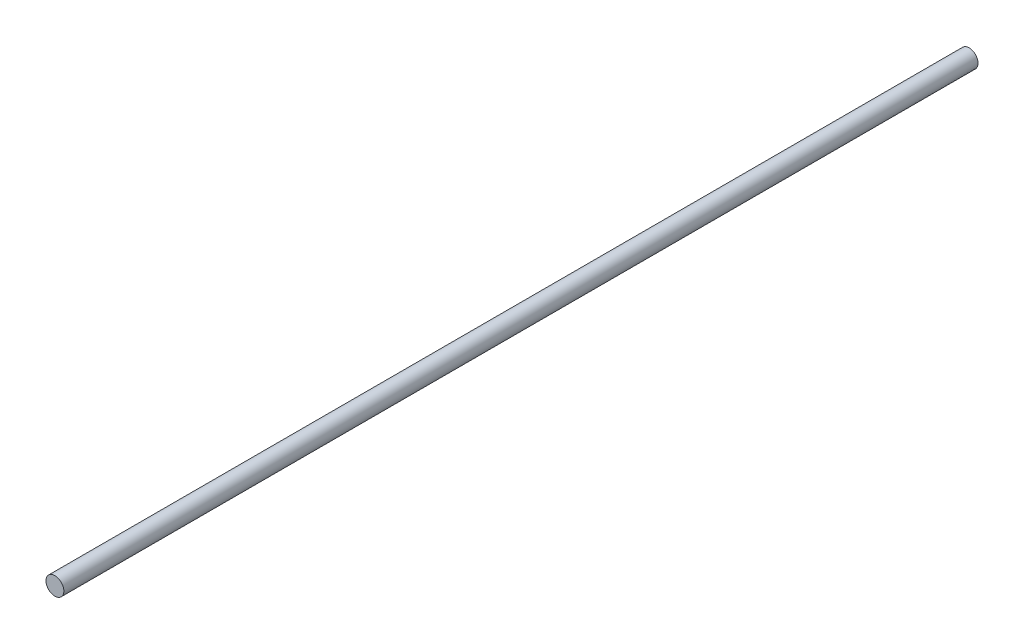
ISO-10303-21;
HEADER;
FILE_DESCRIPTION(('STEP AP214'),'2;1');
FILE_NAME('part.step','',(''),(''),'','','');
FILE_SCHEMA(('AUTOMOTIVE_DESIGN { 1 0 10303 214 1 1 1 1 }'));
ENDSEC;
DATA;
#1=APPLICATION_CONTEXT('core data for automotive mechanical design processes');
#2=APPLICATION_PROTOCOL_DEFINITION('international standard','automotive_design',2000,#1);
#3=PRODUCT_CONTEXT('',#1,'mechanical');
#4=PRODUCT('Part','Part','',(#3));
#5=PRODUCT_RELATED_PRODUCT_CATEGORY('part','',(#4));
#6=PRODUCT_DEFINITION_FORMATION('','',#4);
#7=PRODUCT_DEFINITION_CONTEXT('part definition',#1,'design');
#8=PRODUCT_DEFINITION('design','',#6,#7);
#9=PRODUCT_DEFINITION_SHAPE('','',#8);
#10=(LENGTH_UNIT() NAMED_UNIT(*) SI_UNIT(.MILLI.,.METRE.));
#11=(NAMED_UNIT(*) PLANE_ANGLE_UNIT() SI_UNIT($,.RADIAN.));
#12=(NAMED_UNIT(*) SI_UNIT($,.STERADIAN.) SOLID_ANGLE_UNIT());
#13=UNCERTAINTY_MEASURE_WITH_UNIT(LENGTH_MEASURE(1.E-05),#10,'distance_accuracy_value','');
#14=(GEOMETRIC_REPRESENTATION_CONTEXT(3) GLOBAL_UNCERTAINTY_ASSIGNED_CONTEXT((#13)) GLOBAL_UNIT_ASSIGNED_CONTEXT((#10,
#11,#12)) REPRESENTATION_CONTEXT('',''));
#15=CARTESIAN_POINT('',(0.,0.,0.));
#16=DIRECTION('',(0.,0.,1.));
#17=DIRECTION('',(1.,0.,0.));
#18=AXIS2_PLACEMENT_3D('',#15,#16,#17);
#19=CARTESIAN_POINT('',(0.,0.,-631.970562748477));
#20=DIRECTION('',(0.,0.,1.));
#21=DIRECTION('',(1.,0.,0.));
#22=AXIS2_PLACEMENT_3D('',#19,#20,#21);
#23=CYLINDRICAL_SURFACE('',#22,5.99999999999999);
#24=CARTESIAN_POINT('',(0.,0.,-615.));
#25=DIRECTION('',(0.,0.,1.));
#26=DIRECTION('',(1.,0.,0.));
#27=AXIS2_PLACEMENT_3D('',#24,#25,#26);
#28=CIRCLE('',#27,5.99999999999999);
#29=CARTESIAN_POINT('',(5.99999999999999,0.,-615.));
#30=VERTEX_POINT('',#29);
#31=EDGE_CURVE('E10',#30,#30,#28,.F.);
#32=ORIENTED_EDGE('',*,*,#31,.F.);
#33=EDGE_LOOP('',(#32));
#34=FACE_BOUND('',#33,.T.);
#35=CARTESIAN_POINT('',(0.,0.,0.));
#36=DIRECTION('',(0.,0.,1.));
#37=DIRECTION('',(1.,0.,0.));
#38=AXIS2_PLACEMENT_3D('',#35,#36,#37);
#39=CIRCLE('',#38,5.99999999999999);
#40=CARTESIAN_POINT('',(5.99999999999999,0.,0.));
#41=VERTEX_POINT('',#40);
#42=EDGE_CURVE('E37',#41,#41,#39,.T.);
#43=ORIENTED_EDGE('',*,*,#42,.F.);
#44=EDGE_LOOP('',(#43));
#45=FACE_BOUND('',#44,.T.);
#46=ADVANCED_FACE('F31',(#34,#45),#23,.T.);
#47=CARTESIAN_POINT('',(0.,0.,0.));
#48=DIRECTION('',(0.,0.,1.));
#49=DIRECTION('',(1.,0.,0.));
#50=AXIS2_PLACEMENT_3D('',#47,#48,#49);
#51=PLANE('',#50);
#52=ORIENTED_EDGE('',*,*,#42,.T.);
#53=EDGE_LOOP('',(#52));
#54=FACE_BOUND('',#53,.T.);
#55=ADVANCED_FACE('F43',(#54),#51,.T.);
#56=CARTESIAN_POINT('',(85.0927815338976,492.706016334132,-615.));
#57=DIRECTION('',(0.,0.,1.));
#58=DIRECTION('',(-0.170185563067076,-0.985412032666307,0.));
#59=AXIS2_PLACEMENT_3D('',#56,#57,#58);
#60=PLANE('',#59);
#61=ORIENTED_EDGE('',*,*,#31,.T.);
#62=EDGE_LOOP('',(#61));
#63=FACE_BOUND('',#62,.T.);
#64=ADVANCED_FACE('F50',(#63),#60,.F.);
#65=CLOSED_SHELL('',(#46,#55,#64));
#66=MANIFOLD_SOLID_BREP('B2',#65);
#67=ADVANCED_BREP_SHAPE_REPRESENTATION('',(#18,#66),#14);
#68=SHAPE_DEFINITION_REPRESENTATION(#9,#67);
ENDSEC;
END-ISO-10303-21;
